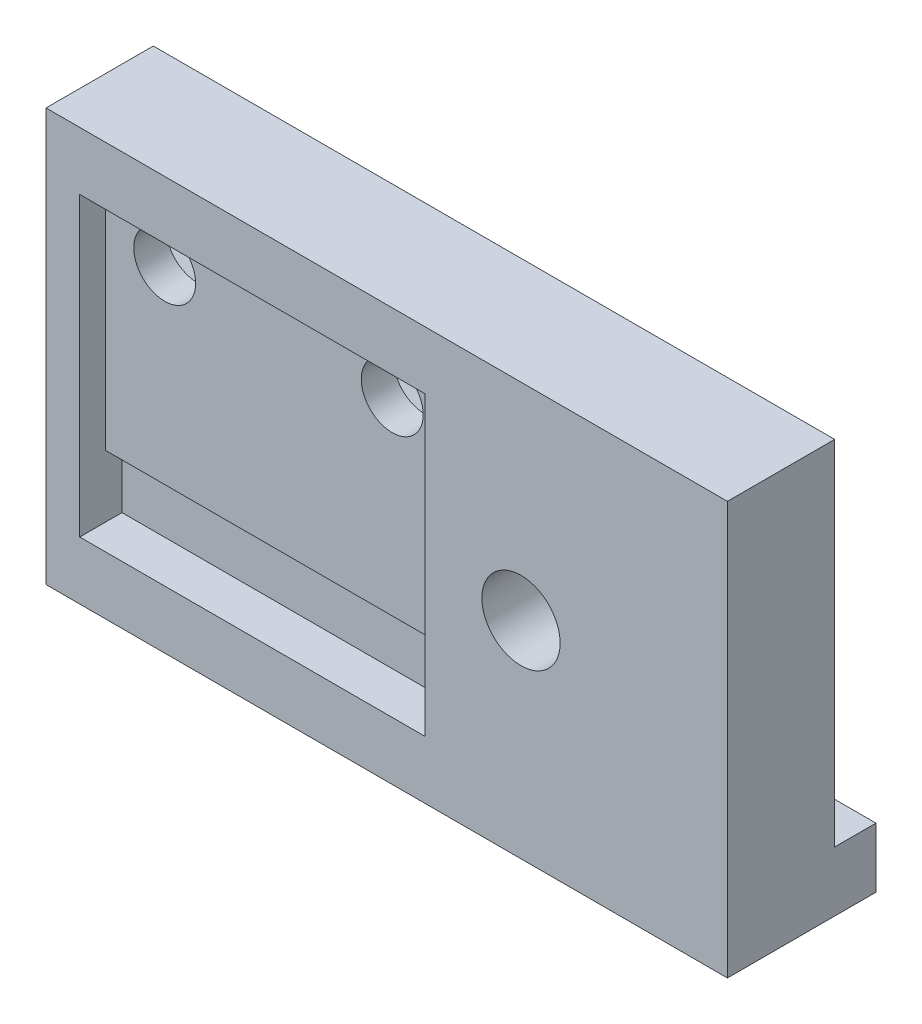
ISO-10303-21;
HEADER;
FILE_DESCRIPTION(('STEP AP214'),'2;1');
FILE_NAME('part.step','',(''),(''),'','','');
FILE_SCHEMA(('AUTOMOTIVE_DESIGN { 1 0 10303 214 1 1 1 1 }'));
ENDSEC;
DATA;
#1=APPLICATION_CONTEXT('core data for automotive mechanical design processes');
#2=APPLICATION_PROTOCOL_DEFINITION('international standard','automotive_design',2000,#1);
#3=PRODUCT_CONTEXT('',#1,'mechanical');
#4=PRODUCT('Part','Part','',(#3));
#5=PRODUCT_RELATED_PRODUCT_CATEGORY('part','',(#4));
#6=PRODUCT_DEFINITION_FORMATION('','',#4);
#7=PRODUCT_DEFINITION_CONTEXT('part definition',#1,'design');
#8=PRODUCT_DEFINITION('design','',#6,#7);
#9=PRODUCT_DEFINITION_SHAPE('','',#8);
#10=(LENGTH_UNIT() NAMED_UNIT(*) SI_UNIT(.MILLI.,.METRE.));
#11=(NAMED_UNIT(*) PLANE_ANGLE_UNIT() SI_UNIT($,.RADIAN.));
#12=(NAMED_UNIT(*) SI_UNIT($,.STERADIAN.) SOLID_ANGLE_UNIT());
#13=UNCERTAINTY_MEASURE_WITH_UNIT(LENGTH_MEASURE(1.E-05),#10,'distance_accuracy_value','');
#14=(GEOMETRIC_REPRESENTATION_CONTEXT(3) GLOBAL_UNCERTAINTY_ASSIGNED_CONTEXT((#13)) GLOBAL_UNIT_ASSIGNED_CONTEXT((#10,
#11,#12)) REPRESENTATION_CONTEXT('',''));
#15=CARTESIAN_POINT('',(0.,0.,0.));
#16=DIRECTION('',(0.,0.,1.));
#17=DIRECTION('',(1.,0.,0.));
#18=AXIS2_PLACEMENT_3D('',#15,#16,#17);
#19=CARTESIAN_POINT('',(0.,0.,0.));
#20=DIRECTION('',(0.,0.,-1.));
#21=DIRECTION('',(-1.,0.,0.));
#22=AXIS2_PLACEMENT_3D('',#19,#20,#21);
#23=PLANE('',#22);
#24=CARTESIAN_POINT('',(19.7,19.05,0.));
#25=DIRECTION('',(0.,0.,1.));
#26=DIRECTION('',(1.,0.,0.));
#27=AXIS2_PLACEMENT_3D('',#24,#25,#26);
#28=CIRCLE('',#27,1.9039967);
#29=CARTESIAN_POINT('',(21.6039967,19.05,0.));
#30=VERTEX_POINT('',#29);
#31=EDGE_CURVE('E459',#30,#30,#28,.T.);
#32=ORIENTED_EDGE('',*,*,#31,.T.);
#33=EDGE_LOOP('',(#32));
#34=FACE_BOUND('',#33,.T.);
#35=DIRECTION('',(-0.866025403784439,-0.5,0.));
#36=VECTOR('',#35,1.);
#37=CARTESIAN_POINT('',(22.8309945,17.2423194825938,0.));
#38=LINE('',#37,#36);
#39=CARTESIAN_POINT('',(22.8309945,17.2423194825938,0.));
#40=VERTEX_POINT('',#39);
#41=CARTESIAN_POINT('',(19.7,15.4346389651875,0.));
#42=VERTEX_POINT('',#41);
#43=EDGE_CURVE('E339',#40,#42,#38,.T.);
#44=ORIENTED_EDGE('',*,*,#43,.T.);
#45=DIRECTION('',(-0.866025403784438,0.5,0.));
#46=VECTOR('',#45,1.);
#47=CARTESIAN_POINT('',(19.7,15.4346389651875,0.));
#48=LINE('',#47,#46);
#49=CARTESIAN_POINT('',(16.5690055,17.2423194825938,0.));
#50=VERTEX_POINT('',#49);
#51=EDGE_CURVE('E334',#42,#50,#48,.T.);
#52=ORIENTED_EDGE('',*,*,#51,.T.);
#53=DIRECTION('',(0.,1.,0.));
#54=VECTOR('',#53,1.);
#55=CARTESIAN_POINT('',(16.5690055,17.2423194825938,0.));
#56=LINE('',#55,#54);
#57=CARTESIAN_POINT('',(16.5690055,20.8576805174062,0.));
#58=VERTEX_POINT('',#57);
#59=EDGE_CURVE('E358',#50,#58,#56,.T.);
#60=ORIENTED_EDGE('',*,*,#59,.T.);
#61=DIRECTION('',(0.866025403784438,0.5,0.));
#62=VECTOR('',#61,1.);
#63=CARTESIAN_POINT('',(16.5690055,20.8576805174062,0.));
#64=LINE('',#63,#62);
#65=CARTESIAN_POINT('',(19.7,22.6653610348125,0.));
#66=VERTEX_POINT('',#65);
#67=EDGE_CURVE('E362',#58,#66,#64,.T.);
#68=ORIENTED_EDGE('',*,*,#67,.T.);
#69=DIRECTION('',(0.866025403784439,-0.5,0.));
#70=VECTOR('',#69,1.);
#71=CARTESIAN_POINT('',(19.7,22.6653610348125,0.));
#72=LINE('',#71,#70);
#73=CARTESIAN_POINT('',(22.8309945,20.8576805174062,0.));
#74=VERTEX_POINT('',#73);
#75=EDGE_CURVE('E366',#66,#74,#72,.T.);
#76=ORIENTED_EDGE('',*,*,#75,.T.);
#77=DIRECTION('',(0.,-1.,0.));
#78=VECTOR('',#77,1.);
#79=CARTESIAN_POINT('',(22.8309945,20.8576805174062,0.));
#80=LINE('',#79,#78);
#81=EDGE_CURVE('E370',#74,#40,#80,.T.);
#82=ORIENTED_EDGE('',*,*,#81,.T.);
#83=EDGE_LOOP('',(#44,#52,#60,#68,#76,#82));
#84=FACE_BOUND('',#83,.T.);
#85=ADVANCED_FACE('F39',(#34,#84),#23,.T.);
#86=CARTESIAN_POINT('',(5.7,19.05,0.));
#87=DIRECTION('',(0.,0.,1.));
#88=DIRECTION('',(1.,0.,0.));
#89=AXIS2_PLACEMENT_3D('',#86,#87,#88);
#90=CIRCLE('',#89,1.9039967);
#91=CARTESIAN_POINT('',(7.6039967,19.05,0.));
#92=VERTEX_POINT('',#91);
#93=EDGE_CURVE('E464',#92,#92,#90,.T.);
#94=ORIENTED_EDGE('',*,*,#93,.T.);
#95=EDGE_LOOP('',(#94));
#96=FACE_BOUND('',#95,.T.);
#97=DIRECTION('',(-0.866025403784438,0.500000000000001,0.));
#98=VECTOR('',#97,1.);
#99=CARTESIAN_POINT('',(5.7,15.4346389651875,0.));
#100=LINE('',#99,#98);
#101=CARTESIAN_POINT('',(5.7,15.4346389651875,0.));
#102=VERTEX_POINT('',#101);
#103=CARTESIAN_POINT('',(2.5690055,17.2423194825938,0.));
#104=VERTEX_POINT('',#103);
#105=EDGE_CURVE('E277',#102,#104,#100,.T.);
#106=ORIENTED_EDGE('',*,*,#105,.T.);
#107=DIRECTION('',(0.,1.,0.));
#108=VECTOR('',#107,1.);
#109=CARTESIAN_POINT('',(2.5690055,17.2423194825938,0.));
#110=LINE('',#109,#108);
#111=CARTESIAN_POINT('',(2.5690055,20.8576805174062,0.));
#112=VERTEX_POINT('',#111);
#113=EDGE_CURVE('E272',#104,#112,#110,.T.);
#114=ORIENTED_EDGE('',*,*,#113,.T.);
#115=DIRECTION('',(0.866025403784439,0.5,0.));
#116=VECTOR('',#115,1.);
#117=CARTESIAN_POINT('',(2.5690055,20.8576805174062,0.));
#118=LINE('',#117,#116);
#119=CARTESIAN_POINT('',(5.69999999999999,22.6653610348125,0.));
#120=VERTEX_POINT('',#119);
#121=EDGE_CURVE('E297',#112,#120,#118,.T.);
#122=ORIENTED_EDGE('',*,*,#121,.T.);
#123=DIRECTION('',(0.866025403784439,-0.5,0.));
#124=VECTOR('',#123,1.);
#125=CARTESIAN_POINT('',(5.69999999999999,22.6653610348125,0.));
#126=LINE('',#125,#124);
#127=CARTESIAN_POINT('',(8.83099449999999,20.8576805174062,0.));
#128=VERTEX_POINT('',#127);
#129=EDGE_CURVE('E301',#120,#128,#126,.T.);
#130=ORIENTED_EDGE('',*,*,#129,.T.);
#131=DIRECTION('',(0.,-1.,0.));
#132=VECTOR('',#131,1.);
#133=CARTESIAN_POINT('',(8.83099449999999,20.8576805174062,0.));
#134=LINE('',#133,#132);
#135=CARTESIAN_POINT('',(8.83099449999999,17.2423194825938,0.));
#136=VERTEX_POINT('',#135);
#137=EDGE_CURVE('E305',#128,#136,#134,.T.);
#138=ORIENTED_EDGE('',*,*,#137,.T.);
#139=DIRECTION('',(-0.866025403784439,-0.5,0.));
#140=VECTOR('',#139,1.);
#141=CARTESIAN_POINT('',(8.83099449999999,17.2423194825938,0.));
#142=LINE('',#141,#140);
#143=EDGE_CURVE('E309',#136,#102,#142,.T.);
#144=ORIENTED_EDGE('',*,*,#143,.T.);
#145=EDGE_LOOP('',(#106,#114,#122,#130,#138,#144));
#146=FACE_BOUND('',#145,.T.);
#147=ADVANCED_FACE('F533',(#96,#146),#23,.T.);
#148=CARTESIAN_POINT('',(0.,0.,2.));
#149=DIRECTION('',(0.,0.,-1.));
#150=DIRECTION('',(-1.,0.,0.));
#151=AXIS2_PLACEMENT_3D('',#148,#149,#150);
#152=PLANE('',#151);
#153=DIRECTION('',(0.,-1.,0.));
#154=VECTOR('',#153,1.);
#155=CARTESIAN_POINT('',(2.073,3.573,2.));
#156=LINE('',#155,#154);
#157=CARTESIAN_POINT('',(2.073,21.827,2.));
#158=VERTEX_POINT('',#157);
#159=CARTESIAN_POINT('',(2.073,7.383,2.));
#160=VERTEX_POINT('',#159);
#161=EDGE_CURVE('E418',#158,#160,#156,.T.);
#162=ORIENTED_EDGE('',*,*,#161,.T.);
#163=DIRECTION('',(-1.,0.,0.));
#164=VECTOR('',#163,1.);
#165=CARTESIAN_POINT('',(2.073,7.383,2.));
#166=LINE('',#165,#164);
#167=CARTESIAN_POINT('',(23.327,7.383,2.));
#168=VERTEX_POINT('',#167);
#169=EDGE_CURVE('E231',#168,#160,#166,.T.);
#170=ORIENTED_EDGE('',*,*,#169,.F.);
#171=DIRECTION('',(0.,1.,0.));
#172=VECTOR('',#171,1.);
#173=CARTESIAN_POINT('',(23.327,3.573,2.));
#174=LINE('',#173,#172);
#175=CARTESIAN_POINT('',(23.327,21.827,2.));
#176=VERTEX_POINT('',#175);
#177=EDGE_CURVE('E413',#168,#176,#174,.T.);
#178=ORIENTED_EDGE('',*,*,#177,.T.);
#179=DIRECTION('',(-1.,0.,0.));
#180=VECTOR('',#179,1.);
#181=CARTESIAN_POINT('',(2.073,21.827,2.));
#182=LINE('',#181,#180);
#183=EDGE_CURVE('E428',#176,#158,#182,.T.);
#184=ORIENTED_EDGE('',*,*,#183,.T.);
#185=EDGE_LOOP('',(#162,#170,#178,#184));
#186=FACE_BOUND('',#185,.T.);
#187=CARTESIAN_POINT('',(5.7,19.05,2.));
#188=DIRECTION('',(0.,0.,1.));
#189=DIRECTION('',(1.,0.,0.));
#190=AXIS2_PLACEMENT_3D('',#187,#188,#189);
#191=CIRCLE('',#190,1.9039967);
#192=CARTESIAN_POINT('',(7.6039967,19.05,2.));
#193=VERTEX_POINT('',#192);
#194=EDGE_CURVE('E468',#193,#193,#191,.T.);
#195=ORIENTED_EDGE('',*,*,#194,.F.);
#196=EDGE_LOOP('',(#195));
#197=FACE_BOUND('',#196,.T.);
#198=CARTESIAN_POINT('',(19.7,19.05,2.));
#199=DIRECTION('',(0.,0.,1.));
#200=DIRECTION('',(1.,0.,0.));
#201=AXIS2_PLACEMENT_3D('',#198,#199,#200);
#202=CIRCLE('',#201,1.9039967);
#203=CARTESIAN_POINT('',(21.6039967,19.05,2.));
#204=VERTEX_POINT('',#203);
#205=EDGE_CURVE('E460',#204,#204,#202,.T.);
#206=ORIENTED_EDGE('',*,*,#205,.F.);
#207=EDGE_LOOP('',(#206));
#208=FACE_BOUND('',#207,.T.);
#209=ADVANCED_FACE('F562',(#186,#197,#208),#152,.F.);
#210=CARTESIAN_POINT('',(0.,0.,2.));
#211=DIRECTION('',(1.,0.,0.));
#212=DIRECTION('',(0.,0.,-1.));
#213=AXIS2_PLACEMENT_3D('',#210,#211,#212);
#214=PLANE('',#213);
#215=DIRECTION('',(0.,0.,-1.));
#216=VECTOR('',#215,1.);
#217=CARTESIAN_POINT('',(0.,25.4,2.));
#218=LINE('',#217,#216);
#219=CARTESIAN_POINT('',(0.,25.4,3.6));
#220=VERTEX_POINT('',#219);
#221=CARTESIAN_POINT('',(0.,25.4,-3.));
#222=VERTEX_POINT('',#221);
#223=EDGE_CURVE('E472',#220,#222,#218,.T.);
#224=ORIENTED_EDGE('',*,*,#223,.T.);
#225=DIRECTION('',(0.,1.,0.));
#226=VECTOR('',#225,1.);
#227=CARTESIAN_POINT('',(0.,0.,-3.));
#228=LINE('',#227,#226);
#229=CARTESIAN_POINT('',(0.,3.683,-3.));
#230=VERTEX_POINT('',#229);
#231=EDGE_CURVE('E399',#230,#222,#228,.T.);
#232=ORIENTED_EDGE('',*,*,#231,.F.);
#233=DIRECTION('',(0.,0.,1.));
#234=VECTOR('',#233,1.);
#235=CARTESIAN_POINT('',(0.,3.683,-5.54));
#236=LINE('',#235,#234);
#237=CARTESIAN_POINT('',(0.,3.683,-5.54));
#238=VERTEX_POINT('',#237);
#239=EDGE_CURVE('E268',#238,#230,#236,.T.);
#240=ORIENTED_EDGE('',*,*,#239,.F.);
#241=DIRECTION('',(0.,1.,0.));
#242=VECTOR('',#241,1.);
#243=CARTESIAN_POINT('',(0.,0.,-5.54));
#244=LINE('',#243,#242);
#245=CARTESIAN_POINT('',(0.,0.,-5.54));
#246=VERTEX_POINT('',#245);
#247=EDGE_CURVE('E247',#246,#238,#244,.T.);
#248=ORIENTED_EDGE('',*,*,#247,.F.);
#249=DIRECTION('',(0.,0.,-1.));
#250=VECTOR('',#249,1.);
#251=CARTESIAN_POINT('',(0.,0.,2.));
#252=LINE('',#251,#250);
#253=CARTESIAN_POINT('',(0.,0.,3.6));
#254=VERTEX_POINT('',#253);
#255=EDGE_CURVE('E11',#254,#246,#252,.T.);
#256=ORIENTED_EDGE('',*,*,#255,.F.);
#257=DIRECTION('',(0.,-1.,0.));
#258=VECTOR('',#257,1.);
#259=CARTESIAN_POINT('',(0.,25.4,3.6));
#260=LINE('',#259,#258);
#261=EDGE_CURVE('E447',#220,#254,#260,.T.);
#262=ORIENTED_EDGE('',*,*,#261,.F.);
#263=EDGE_LOOP('',(#224,#232,#240,#248,#256,#262));
#264=FACE_BOUND('',#263,.T.);
#265=ADVANCED_FACE('F41',(#264),#214,.F.);
#266=CARTESIAN_POINT('',(0.,0.,2.));
#267=DIRECTION('',(0.,1.,0.));
#268=DIRECTION('',(0.,0.,1.));
#269=AXIS2_PLACEMENT_3D('',#266,#267,#268);
#270=PLANE('',#269);
#271=ORIENTED_EDGE('',*,*,#255,.T.);
#272=DIRECTION('',(-1.,0.,0.));
#273=VECTOR('',#272,1.);
#274=CARTESIAN_POINT('',(41.925,0.,-5.54));
#275=LINE('',#274,#273);
#276=CARTESIAN_POINT('',(41.925,0.,-5.54));
#277=VERTEX_POINT('',#276);
#278=EDGE_CURVE('E258',#277,#246,#275,.T.);
#279=ORIENTED_EDGE('',*,*,#278,.F.);
#280=DIRECTION('',(0.,0.,-1.));
#281=VECTOR('',#280,1.);
#282=CARTESIAN_POINT('',(41.925,0.,2.));
#283=LINE('',#282,#281);
#284=CARTESIAN_POINT('',(41.925,0.,3.6));
#285=VERTEX_POINT('',#284);
#286=EDGE_CURVE('E48',#285,#277,#283,.T.);
#287=ORIENTED_EDGE('',*,*,#286,.F.);
#288=DIRECTION('',(1.,0.,0.));
#289=VECTOR('',#288,1.);
#290=CARTESIAN_POINT('',(0.,0.,3.6));
#291=LINE('',#290,#289);
#292=EDGE_CURVE('E451',#254,#285,#291,.T.);
#293=ORIENTED_EDGE('',*,*,#292,.F.);
#294=EDGE_LOOP('',(#271,#279,#287,#293));
#295=FACE_BOUND('',#294,.T.);
#296=ADVANCED_FACE('F493',(#295),#270,.F.);
#297=CARTESIAN_POINT('',(41.925,0.,2.));
#298=DIRECTION('',(-1.,0.,0.));
#299=DIRECTION('',(0.,0.,1.));
#300=AXIS2_PLACEMENT_3D('',#297,#298,#299);
#301=PLANE('',#300);
#302=ORIENTED_EDGE('',*,*,#286,.T.);
#303=DIRECTION('',(0.,-1.,0.));
#304=VECTOR('',#303,1.);
#305=CARTESIAN_POINT('',(41.925,3.68299999999999,-5.54));
#306=LINE('',#305,#304);
#307=CARTESIAN_POINT('',(41.925,3.68299999999999,-5.54));
#308=VERTEX_POINT('',#307);
#309=EDGE_CURVE('E254',#308,#277,#306,.T.);
#310=ORIENTED_EDGE('',*,*,#309,.F.);
#311=DIRECTION('',(0.,0.,1.));
#312=VECTOR('',#311,1.);
#313=CARTESIAN_POINT('',(41.925,3.68299999999999,-5.54));
#314=LINE('',#313,#312);
#315=CARTESIAN_POINT('',(41.925,3.68299999999999,-3.));
#316=VERTEX_POINT('',#315);
#317=EDGE_CURVE('E262',#308,#316,#314,.T.);
#318=ORIENTED_EDGE('',*,*,#317,.T.);
#319=DIRECTION('',(0.,-1.,0.));
#320=VECTOR('',#319,1.);
#321=CARTESIAN_POINT('',(41.925,25.4,-3.));
#322=LINE('',#321,#320);
#323=CARTESIAN_POINT('',(41.925,25.4,-3.));
#324=VERTEX_POINT('',#323);
#325=EDGE_CURVE('E406',#324,#316,#322,.T.);
#326=ORIENTED_EDGE('',*,*,#325,.F.);
#327=DIRECTION('',(0.,0.,-1.));
#328=VECTOR('',#327,1.);
#329=CARTESIAN_POINT('',(41.925,25.4,2.));
#330=LINE('',#329,#328);
#331=CARTESIAN_POINT('',(41.925,25.4,3.6));
#332=VERTEX_POINT('',#331);
#333=EDGE_CURVE('E479',#332,#324,#330,.T.);
#334=ORIENTED_EDGE('',*,*,#333,.F.);
#335=DIRECTION('',(0.,1.,0.));
#336=VECTOR('',#335,1.);
#337=CARTESIAN_POINT('',(41.925,0.,3.6));
#338=LINE('',#337,#336);
#339=EDGE_CURVE('E455',#285,#332,#338,.T.);
#340=ORIENTED_EDGE('',*,*,#339,.F.);
#341=EDGE_LOOP('',(#302,#310,#318,#326,#334,#340));
#342=FACE_BOUND('',#341,.T.);
#343=ADVANCED_FACE('F485',(#342),#301,.F.);
#344=CARTESIAN_POINT('',(0.,25.4,2.));
#345=DIRECTION('',(0.,-1.,0.));
#346=DIRECTION('',(0.,0.,-1.));
#347=AXIS2_PLACEMENT_3D('',#344,#345,#346);
#348=PLANE('',#347);
#349=ORIENTED_EDGE('',*,*,#333,.T.);
#350=DIRECTION('',(1.,0.,0.));
#351=VECTOR('',#350,1.);
#352=CARTESIAN_POINT('',(0.,25.4,-3.));
#353=LINE('',#352,#351);
#354=EDGE_CURVE('E402',#222,#324,#353,.T.);
#355=ORIENTED_EDGE('',*,*,#354,.F.);
#356=ORIENTED_EDGE('',*,*,#223,.F.);
#357=DIRECTION('',(-1.,0.,0.));
#358=VECTOR('',#357,1.);
#359=CARTESIAN_POINT('',(41.925,25.4,3.6));
#360=LINE('',#359,#358);
#361=EDGE_CURVE('E443',#332,#220,#360,.T.);
#362=ORIENTED_EDGE('',*,*,#361,.F.);
#363=EDGE_LOOP('',(#349,#355,#356,#362));
#364=FACE_BOUND('',#363,.T.);
#365=ADVANCED_FACE('F502',(#364),#348,.F.);
#366=CARTESIAN_POINT('',(5.7,19.05,2.));
#367=DIRECTION('',(0.,0.,-1.));
#368=DIRECTION('',(-1.,0.,0.));
#369=AXIS2_PLACEMENT_3D('',#366,#367,#368);
#370=CYLINDRICAL_SURFACE('',#369,1.9039967);
#371=ORIENTED_EDGE('',*,*,#194,.T.);
#372=EDGE_LOOP('',(#371));
#373=FACE_BOUND('',#372,.T.);
#374=ORIENTED_EDGE('',*,*,#93,.F.);
#375=EDGE_LOOP('',(#374));
#376=FACE_BOUND('',#375,.T.);
#377=ADVANCED_FACE('F570',(#373,#376),#370,.F.);
#378=CARTESIAN_POINT('',(19.7,19.05,2.));
#379=DIRECTION('',(0.,0.,-1.));
#380=DIRECTION('',(-1.,0.,0.));
#381=AXIS2_PLACEMENT_3D('',#378,#379,#380);
#382=CYLINDRICAL_SURFACE('',#381,1.9039967);
#383=ORIENTED_EDGE('',*,*,#205,.T.);
#384=EDGE_LOOP('',(#383));
#385=FACE_BOUND('',#384,.T.);
#386=ORIENTED_EDGE('',*,*,#31,.F.);
#387=EDGE_LOOP('',(#386));
#388=FACE_BOUND('',#387,.T.);
#389=ADVANCED_FACE('F588',(#385,#388),#382,.F.);
#390=CARTESIAN_POINT('',(29.225,12.7,2.));
#391=DIRECTION('',(0.,0.,-1.));
#392=DIRECTION('',(-1.,0.,0.));
#393=AXIS2_PLACEMENT_3D('',#390,#391,#392);
#394=CYLINDRICAL_SURFACE('',#393,2.40665);
#395=CARTESIAN_POINT('',(29.225,12.7,3.6));
#396=DIRECTION('',(0.,0.,1.));
#397=DIRECTION('',(1.,0.,0.));
#398=AXIS2_PLACEMENT_3D('',#395,#396,#397);
#399=CIRCLE('',#398,2.40665);
#400=CARTESIAN_POINT('',(31.63165,12.7,3.6));
#401=VERTEX_POINT('',#400);
#402=EDGE_CURVE('E409',#401,#401,#399,.T.);
#403=ORIENTED_EDGE('',*,*,#402,.T.);
#404=EDGE_LOOP('',(#403));
#405=FACE_BOUND('',#404,.T.);
#406=CARTESIAN_POINT('',(29.225,12.7,-3.));
#407=DIRECTION('',(0.,0.,-1.));
#408=DIRECTION('',(-1.,0.,0.));
#409=AXIS2_PLACEMENT_3D('',#406,#407,#408);
#410=CIRCLE('',#409,2.40665);
#411=CARTESIAN_POINT('',(26.81835,12.7,-3.));
#412=VERTEX_POINT('',#411);
#413=EDGE_CURVE('E395',#412,#412,#410,.T.);
#414=ORIENTED_EDGE('',*,*,#413,.T.);
#415=EDGE_LOOP('',(#414));
#416=FACE_BOUND('',#415,.T.);
#417=ADVANCED_FACE('F591',(#405,#416),#394,.F.);
#418=CARTESIAN_POINT('',(0.,0.,3.6));
#419=DIRECTION('',(0.,0.,1.));
#420=DIRECTION('',(1.,0.,0.));
#421=AXIS2_PLACEMENT_3D('',#418,#419,#420);
#422=PLANE('',#421);
#423=DIRECTION('',(-1.,0.,0.));
#424=VECTOR('',#423,1.);
#425=CARTESIAN_POINT('',(2.073,21.827,3.6));
#426=LINE('',#425,#424);
#427=CARTESIAN_POINT('',(23.327,21.827,3.6));
#428=VERTEX_POINT('',#427);
#429=CARTESIAN_POINT('',(2.073,21.827,3.6));
#430=VERTEX_POINT('',#429);
#431=EDGE_CURVE('E417',#428,#430,#426,.T.);
#432=ORIENTED_EDGE('',*,*,#431,.F.);
#433=DIRECTION('',(0.,1.,0.));
#434=VECTOR('',#433,1.);
#435=CARTESIAN_POINT('',(23.327,3.573,3.6));
#436=LINE('',#435,#434);
#437=CARTESIAN_POINT('',(23.327,3.573,3.6));
#438=VERTEX_POINT('',#437);
#439=EDGE_CURVE('E414',#438,#428,#436,.T.);
#440=ORIENTED_EDGE('',*,*,#439,.F.);
#441=DIRECTION('',(1.,0.,0.));
#442=VECTOR('',#441,1.);
#443=CARTESIAN_POINT('',(2.073,3.573,3.6));
#444=LINE('',#443,#442);
#445=CARTESIAN_POINT('',(2.073,3.573,3.6));
#446=VERTEX_POINT('',#445);
#447=EDGE_CURVE('E423',#446,#438,#444,.T.);
#448=ORIENTED_EDGE('',*,*,#447,.F.);
#449=DIRECTION('',(0.,-1.,0.));
#450=VECTOR('',#449,1.);
#451=CARTESIAN_POINT('',(2.073,3.573,3.6));
#452=LINE('',#451,#450);
#453=EDGE_CURVE('E210',#430,#446,#452,.T.);
#454=ORIENTED_EDGE('',*,*,#453,.F.);
#455=EDGE_LOOP('',(#432,#440,#448,#454));
#456=FACE_BOUND('',#455,.T.);
#457=ORIENTED_EDGE('',*,*,#361,.T.);
#458=ORIENTED_EDGE('',*,*,#261,.T.);
#459=ORIENTED_EDGE('',*,*,#292,.T.);
#460=ORIENTED_EDGE('',*,*,#339,.T.);
#461=EDGE_LOOP('',(#457,#458,#459,#460));
#462=FACE_BOUND('',#461,.T.);
#463=ORIENTED_EDGE('',*,*,#402,.F.);
#464=EDGE_LOOP('',(#463));
#465=FACE_BOUND('',#464,.T.);
#466=ADVANCED_FACE('F498',(#456,#462,#465),#422,.T.);
#467=CARTESIAN_POINT('',(23.327,3.573,3.6));
#468=DIRECTION('',(-1.,0.,0.));
#469=DIRECTION('',(0.,0.,1.));
#470=AXIS2_PLACEMENT_3D('',#467,#468,#469);
#471=PLANE('',#470);
#472=ORIENTED_EDGE('',*,*,#177,.F.);
#473=DIRECTION('',(0.,0.,1.));
#474=VECTOR('',#473,1.);
#475=CARTESIAN_POINT('',(23.327,7.383,1.));
#476=LINE('',#475,#474);
#477=CARTESIAN_POINT('',(23.327,7.383,1.));
#478=VERTEX_POINT('',#477);
#479=EDGE_CURVE('E240',#478,#168,#476,.T.);
#480=ORIENTED_EDGE('',*,*,#479,.F.);
#481=DIRECTION('',(0.,1.,0.));
#482=VECTOR('',#481,1.);
#483=CARTESIAN_POINT('',(23.327,7.383,1.));
#484=LINE('',#483,#482);
#485=CARTESIAN_POINT('',(23.327,3.573,1.));
#486=VERTEX_POINT('',#485);
#487=EDGE_CURVE('E225',#486,#478,#484,.T.);
#488=ORIENTED_EDGE('',*,*,#487,.F.);
#489=DIRECTION('',(0.,0.,-1.));
#490=VECTOR('',#489,1.);
#491=CARTESIAN_POINT('',(23.327,3.573,3.6));
#492=LINE('',#491,#490);
#493=EDGE_CURVE('E215',#438,#486,#492,.T.);
#494=ORIENTED_EDGE('',*,*,#493,.F.);
#495=ORIENTED_EDGE('',*,*,#439,.T.);
#496=DIRECTION('',(0.,0.,-1.));
#497=VECTOR('',#496,1.);
#498=CARTESIAN_POINT('',(23.327,21.827,3.6));
#499=LINE('',#498,#497);
#500=EDGE_CURVE('E439',#428,#176,#499,.T.);
#501=ORIENTED_EDGE('',*,*,#500,.T.);
#502=EDGE_LOOP('',(#472,#480,#488,#494,#495,#501));
#503=FACE_BOUND('',#502,.T.);
#504=ADVANCED_FACE('F604',(#503),#471,.T.);
#505=CARTESIAN_POINT('',(2.073,21.827,3.6));
#506=DIRECTION('',(0.,-1.,0.));
#507=DIRECTION('',(0.,0.,-1.));
#508=AXIS2_PLACEMENT_3D('',#505,#506,#507);
#509=PLANE('',#508);
#510=ORIENTED_EDGE('',*,*,#183,.F.);
#511=ORIENTED_EDGE('',*,*,#500,.F.);
#512=ORIENTED_EDGE('',*,*,#431,.T.);
#513=DIRECTION('',(0.,0.,-1.));
#514=VECTOR('',#513,1.);
#515=CARTESIAN_POINT('',(2.073,21.827,3.6));
#516=LINE('',#515,#514);
#517=EDGE_CURVE('E214',#430,#158,#516,.T.);
#518=ORIENTED_EDGE('',*,*,#517,.T.);
#519=EDGE_LOOP('',(#510,#511,#512,#518));
#520=FACE_BOUND('',#519,.T.);
#521=ADVANCED_FACE('F608',(#520),#509,.T.);
#522=CARTESIAN_POINT('',(2.073,3.573,3.6));
#523=DIRECTION('',(1.,0.,0.));
#524=DIRECTION('',(0.,0.,-1.));
#525=AXIS2_PLACEMENT_3D('',#522,#523,#524);
#526=PLANE('',#525);
#527=ORIENTED_EDGE('',*,*,#161,.F.);
#528=ORIENTED_EDGE('',*,*,#517,.F.);
#529=ORIENTED_EDGE('',*,*,#453,.T.);
#530=DIRECTION('',(0.,0.,-1.));
#531=VECTOR('',#530,1.);
#532=CARTESIAN_POINT('',(2.073,3.573,3.6));
#533=LINE('',#532,#531);
#534=CARTESIAN_POINT('',(2.073,3.573,1.));
#535=VERTEX_POINT('',#534);
#536=EDGE_CURVE('E201',#446,#535,#533,.T.);
#537=ORIENTED_EDGE('',*,*,#536,.T.);
#538=DIRECTION('',(0.,-1.,0.));
#539=VECTOR('',#538,1.);
#540=CARTESIAN_POINT('',(2.073,7.383,1.));
#541=LINE('',#540,#539);
#542=CARTESIAN_POINT('',(2.073,7.383,1.));
#543=VERTEX_POINT('',#542);
#544=EDGE_CURVE('E206',#543,#535,#541,.T.);
#545=ORIENTED_EDGE('',*,*,#544,.F.);
#546=DIRECTION('',(0.,0.,1.));
#547=VECTOR('',#546,1.);
#548=CARTESIAN_POINT('',(2.073,7.383,1.));
#549=LINE('',#548,#547);
#550=EDGE_CURVE('E242',#543,#160,#549,.T.);
#551=ORIENTED_EDGE('',*,*,#550,.T.);
#552=EDGE_LOOP('',(#527,#528,#529,#537,#545,#551));
#553=FACE_BOUND('',#552,.T.);
#554=ADVANCED_FACE('F204',(#553),#526,.T.);
#555=CARTESIAN_POINT('',(2.073,3.573,3.6));
#556=DIRECTION('',(0.,1.,0.));
#557=DIRECTION('',(0.,0.,1.));
#558=AXIS2_PLACEMENT_3D('',#555,#556,#557);
#559=PLANE('',#558);
#560=ORIENTED_EDGE('',*,*,#493,.T.);
#561=DIRECTION('',(1.,0.,0.));
#562=VECTOR('',#561,1.);
#563=CARTESIAN_POINT('',(2.073,3.573,1.));
#564=LINE('',#563,#562);
#565=EDGE_CURVE('E218',#535,#486,#564,.T.);
#566=ORIENTED_EDGE('',*,*,#565,.F.);
#567=ORIENTED_EDGE('',*,*,#536,.F.);
#568=ORIENTED_EDGE('',*,*,#447,.T.);
#569=EDGE_LOOP('',(#560,#566,#567,#568));
#570=FACE_BOUND('',#569,.T.);
#571=ADVANCED_FACE('F219',(#570),#559,.T.);
#572=CARTESIAN_POINT('',(0.,0.,-3.));
#573=DIRECTION('',(0.,0.,-1.));
#574=DIRECTION('',(-1.,0.,0.));
#575=AXIS2_PLACEMENT_3D('',#572,#573,#574);
#576=PLANE('',#575);
#577=DIRECTION('',(1.,0.,0.));
#578=VECTOR('',#577,1.);
#579=CARTESIAN_POINT('',(0.,3.683,-3.));
#580=LINE('',#579,#578);
#581=EDGE_CURVE('E55',#230,#316,#580,.T.);
#582=ORIENTED_EDGE('',*,*,#581,.F.);
#583=ORIENTED_EDGE('',*,*,#231,.T.);
#584=ORIENTED_EDGE('',*,*,#354,.T.);
#585=ORIENTED_EDGE('',*,*,#325,.T.);
#586=EDGE_LOOP('',(#582,#583,#584,#585));
#587=FACE_BOUND('',#586,.T.);
#588=ORIENTED_EDGE('',*,*,#413,.F.);
#589=EDGE_LOOP('',(#588));
#590=FACE_BOUND('',#589,.T.);
#591=DIRECTION('',(0.,1.,0.));
#592=VECTOR('',#591,1.);
#593=CARTESIAN_POINT('',(16.5690055,17.2423194825938,-3.));
#594=LINE('',#593,#592);
#595=CARTESIAN_POINT('',(16.5690055,17.2423194825938,-3.));
#596=VERTEX_POINT('',#595);
#597=CARTESIAN_POINT('',(16.5690055,20.8576805174062,-3.));
#598=VERTEX_POINT('',#597);
#599=EDGE_CURVE('E338',#596,#598,#594,.T.);
#600=ORIENTED_EDGE('',*,*,#599,.F.);
#601=DIRECTION('',(-0.866025403784438,0.5,0.));
#602=VECTOR('',#601,1.);
#603=CARTESIAN_POINT('',(19.7,15.4346389651875,-3.));
#604=LINE('',#603,#602);
#605=CARTESIAN_POINT('',(19.7,15.4346389651875,-3.));
#606=VERTEX_POINT('',#605);
#607=EDGE_CURVE('E335',#606,#596,#604,.T.);
#608=ORIENTED_EDGE('',*,*,#607,.F.);
#609=DIRECTION('',(-0.866025403784439,-0.5,0.));
#610=VECTOR('',#609,1.);
#611=CARTESIAN_POINT('',(22.8309945,17.2423194825938,-3.));
#612=LINE('',#611,#610);
#613=CARTESIAN_POINT('',(22.8309945,17.2423194825938,-3.));
#614=VERTEX_POINT('',#613);
#615=EDGE_CURVE('E352',#614,#606,#612,.T.);
#616=ORIENTED_EDGE('',*,*,#615,.F.);
#617=DIRECTION('',(0.,-1.,0.));
#618=VECTOR('',#617,1.);
#619=CARTESIAN_POINT('',(22.8309945,20.8576805174062,-3.));
#620=LINE('',#619,#618);
#621=CARTESIAN_POINT('',(22.8309945,20.8576805174062,-3.));
#622=VERTEX_POINT('',#621);
#623=EDGE_CURVE('E348',#622,#614,#620,.T.);
#624=ORIENTED_EDGE('',*,*,#623,.F.);
#625=DIRECTION('',(0.866025403784439,-0.5,0.));
#626=VECTOR('',#625,1.);
#627=CARTESIAN_POINT('',(19.7,22.6653610348125,-3.));
#628=LINE('',#627,#626);
#629=CARTESIAN_POINT('',(19.7,22.6653610348125,-3.));
#630=VERTEX_POINT('',#629);
#631=EDGE_CURVE('E345',#630,#622,#628,.T.);
#632=ORIENTED_EDGE('',*,*,#631,.F.);
#633=DIRECTION('',(0.866025403784438,0.5,0.));
#634=VECTOR('',#633,1.);
#635=CARTESIAN_POINT('',(16.5690055,20.8576805174062,-3.));
#636=LINE('',#635,#634);
#637=EDGE_CURVE('E342',#598,#630,#636,.T.);
#638=ORIENTED_EDGE('',*,*,#637,.F.);
#639=EDGE_LOOP('',(#600,#608,#616,#624,#632,#638));
#640=FACE_BOUND('',#639,.T.);
#641=DIRECTION('',(0.866025403784439,0.5,0.));
#642=VECTOR('',#641,1.);
#643=CARTESIAN_POINT('',(2.5690055,20.8576805174062,-3.));
#644=LINE('',#643,#642);
#645=CARTESIAN_POINT('',(2.5690055,20.8576805174062,-3.));
#646=VERTEX_POINT('',#645);
#647=CARTESIAN_POINT('',(5.69999999999999,22.6653610348125,-3.));
#648=VERTEX_POINT('',#647);
#649=EDGE_CURVE('E276',#646,#648,#644,.T.);
#650=ORIENTED_EDGE('',*,*,#649,.F.);
#651=DIRECTION('',(0.,1.,0.));
#652=VECTOR('',#651,1.);
#653=CARTESIAN_POINT('',(2.5690055,17.2423194825938,-3.));
#654=LINE('',#653,#652);
#655=CARTESIAN_POINT('',(2.5690055,17.2423194825938,-3.));
#656=VERTEX_POINT('',#655);
#657=EDGE_CURVE('E273',#656,#646,#654,.T.);
#658=ORIENTED_EDGE('',*,*,#657,.F.);
#659=DIRECTION('',(-0.866025403784438,0.500000000000001,0.));
#660=VECTOR('',#659,1.);
#661=CARTESIAN_POINT('',(5.7,15.4346389651875,-3.));
#662=LINE('',#661,#660);
#663=CARTESIAN_POINT('',(5.7,15.4346389651875,-3.));
#664=VERTEX_POINT('',#663);
#665=EDGE_CURVE('E290',#664,#656,#662,.T.);
#666=ORIENTED_EDGE('',*,*,#665,.F.);
#667=DIRECTION('',(-0.866025403784439,-0.5,0.));
#668=VECTOR('',#667,1.);
#669=CARTESIAN_POINT('',(8.83099449999999,17.2423194825938,-3.));
#670=LINE('',#669,#668);
#671=CARTESIAN_POINT('',(8.83099449999999,17.2423194825938,-3.));
#672=VERTEX_POINT('',#671);
#673=EDGE_CURVE('E286',#672,#664,#670,.T.);
#674=ORIENTED_EDGE('',*,*,#673,.F.);
#675=DIRECTION('',(0.,-1.,0.));
#676=VECTOR('',#675,1.);
#677=CARTESIAN_POINT('',(8.83099449999999,20.8576805174062,-3.));
#678=LINE('',#677,#676);
#679=CARTESIAN_POINT('',(8.83099449999999,20.8576805174062,-3.));
#680=VERTEX_POINT('',#679);
#681=EDGE_CURVE('E283',#680,#672,#678,.T.);
#682=ORIENTED_EDGE('',*,*,#681,.F.);
#683=DIRECTION('',(0.866025403784439,-0.5,0.));
#684=VECTOR('',#683,1.);
#685=CARTESIAN_POINT('',(5.69999999999999,22.6653610348125,-3.));
#686=LINE('',#685,#684);
#687=EDGE_CURVE('E280',#648,#680,#686,.T.);
#688=ORIENTED_EDGE('',*,*,#687,.F.);
#689=EDGE_LOOP('',(#650,#658,#666,#674,#682,#688));
#690=FACE_BOUND('',#689,.T.);
#691=ADVANCED_FACE('F507',(#587,#590,#640,#690),#576,.T.);
#692=CARTESIAN_POINT('',(19.7,15.4346389651875,-3.));
#693=DIRECTION('',(0.5,0.866025403784438,0.));
#694=DIRECTION('',(-0.866025403784438,0.5,0.));
#695=AXIS2_PLACEMENT_3D('',#692,#693,#694);
#696=PLANE('',#695);
#697=ORIENTED_EDGE('',*,*,#51,.F.);
#698=DIRECTION('',(0.,0.,1.));
#699=VECTOR('',#698,1.);
#700=CARTESIAN_POINT('',(19.7,15.4346389651875,-3.));
#701=LINE('',#700,#699);
#702=EDGE_CURVE('E63',#606,#42,#701,.T.);
#703=ORIENTED_EDGE('',*,*,#702,.F.);
#704=ORIENTED_EDGE('',*,*,#607,.T.);
#705=DIRECTION('',(0.,0.,1.));
#706=VECTOR('',#705,1.);
#707=CARTESIAN_POINT('',(16.5690055,17.2423194825938,-3.));
#708=LINE('',#707,#706);
#709=EDGE_CURVE('E391',#596,#50,#708,.T.);
#710=ORIENTED_EDGE('',*,*,#709,.T.);
#711=EDGE_LOOP('',(#697,#703,#704,#710));
#712=FACE_BOUND('',#711,.T.);
#713=ADVANCED_FACE('F510',(#712),#696,.T.);
#714=CARTESIAN_POINT('',(16.5690055,17.2423194825938,-3.));
#715=DIRECTION('',(1.,0.,0.));
#716=DIRECTION('',(0.,0.,-1.));
#717=AXIS2_PLACEMENT_3D('',#714,#715,#716);
#718=PLANE('',#717);
#719=ORIENTED_EDGE('',*,*,#59,.F.);
#720=ORIENTED_EDGE('',*,*,#709,.F.);
#721=ORIENTED_EDGE('',*,*,#599,.T.);
#722=DIRECTION('',(0.,0.,1.));
#723=VECTOR('',#722,1.);
#724=CARTESIAN_POINT('',(16.5690055,20.8576805174062,-3.));
#725=LINE('',#724,#723);
#726=EDGE_CURVE('E388',#598,#58,#725,.T.);
#727=ORIENTED_EDGE('',*,*,#726,.T.);
#728=EDGE_LOOP('',(#719,#720,#721,#727));
#729=FACE_BOUND('',#728,.T.);
#730=ADVANCED_FACE('F619',(#729),#718,.T.);
#731=CARTESIAN_POINT('',(16.5690055,20.8576805174062,-3.));
#732=DIRECTION('',(0.5,-0.866025403784438,0.));
#733=DIRECTION('',(0.866025403784438,0.5,0.));
#734=AXIS2_PLACEMENT_3D('',#731,#732,#733);
#735=PLANE('',#734);
#736=ORIENTED_EDGE('',*,*,#67,.F.);
#737=ORIENTED_EDGE('',*,*,#726,.F.);
#738=ORIENTED_EDGE('',*,*,#637,.T.);
#739=DIRECTION('',(0.,0.,1.));
#740=VECTOR('',#739,1.);
#741=CARTESIAN_POINT('',(19.7,22.6653610348125,-3.));
#742=LINE('',#741,#740);
#743=EDGE_CURVE('E385',#630,#66,#742,.T.);
#744=ORIENTED_EDGE('',*,*,#743,.T.);
#745=EDGE_LOOP('',(#736,#737,#738,#744));
#746=FACE_BOUND('',#745,.T.);
#747=ADVANCED_FACE('F623',(#746),#735,.T.);
#748=CARTESIAN_POINT('',(19.7,22.6653610348125,-3.));
#749=DIRECTION('',(-0.5,-0.866025403784439,0.));
#750=DIRECTION('',(0.866025403784439,-0.5,0.));
#751=AXIS2_PLACEMENT_3D('',#748,#749,#750);
#752=PLANE('',#751);
#753=ORIENTED_EDGE('',*,*,#75,.F.);
#754=ORIENTED_EDGE('',*,*,#743,.F.);
#755=ORIENTED_EDGE('',*,*,#631,.T.);
#756=DIRECTION('',(0.,0.,1.));
#757=VECTOR('',#756,1.);
#758=CARTESIAN_POINT('',(22.8309945,20.8576805174062,-3.));
#759=LINE('',#758,#757);
#760=EDGE_CURVE('E382',#622,#74,#759,.T.);
#761=ORIENTED_EDGE('',*,*,#760,.T.);
#762=EDGE_LOOP('',(#753,#754,#755,#761));
#763=FACE_BOUND('',#762,.T.);
#764=ADVANCED_FACE('F627',(#763),#752,.T.);
#765=CARTESIAN_POINT('',(22.8309945,20.8576805174062,-3.));
#766=DIRECTION('',(-1.,0.,0.));
#767=DIRECTION('',(0.,0.,1.));
#768=AXIS2_PLACEMENT_3D('',#765,#766,#767);
#769=PLANE('',#768);
#770=ORIENTED_EDGE('',*,*,#81,.F.);
#771=ORIENTED_EDGE('',*,*,#760,.F.);
#772=ORIENTED_EDGE('',*,*,#623,.T.);
#773=DIRECTION('',(0.,0.,1.));
#774=VECTOR('',#773,1.);
#775=CARTESIAN_POINT('',(22.8309945,17.2423194825938,-3.));
#776=LINE('',#775,#774);
#777=EDGE_CURVE('E379',#614,#40,#776,.T.);
#778=ORIENTED_EDGE('',*,*,#777,.T.);
#779=EDGE_LOOP('',(#770,#771,#772,#778));
#780=FACE_BOUND('',#779,.T.);
#781=ADVANCED_FACE('F631',(#780),#769,.T.);
#782=CARTESIAN_POINT('',(22.8309945,17.2423194825938,-3.));
#783=DIRECTION('',(-0.5,0.866025403784439,0.));
#784=DIRECTION('',(-0.866025403784439,-0.5,0.));
#785=AXIS2_PLACEMENT_3D('',#782,#783,#784);
#786=PLANE('',#785);
#787=ORIENTED_EDGE('',*,*,#43,.F.);
#788=ORIENTED_EDGE('',*,*,#777,.F.);
#789=ORIENTED_EDGE('',*,*,#615,.T.);
#790=ORIENTED_EDGE('',*,*,#702,.T.);
#791=EDGE_LOOP('',(#787,#788,#789,#790));
#792=FACE_BOUND('',#791,.T.);
#793=ADVANCED_FACE('F635',(#792),#786,.T.);
#794=CARTESIAN_POINT('',(2.5690055,17.2423194825938,-3.));
#795=DIRECTION('',(1.,0.,0.));
#796=DIRECTION('',(0.,0.,-1.));
#797=AXIS2_PLACEMENT_3D('',#794,#795,#796);
#798=PLANE('',#797);
#799=ORIENTED_EDGE('',*,*,#113,.F.);
#800=DIRECTION('',(0.,0.,1.));
#801=VECTOR('',#800,1.);
#802=CARTESIAN_POINT('',(2.5690055,17.2423194825938,-3.));
#803=LINE('',#802,#801);
#804=EDGE_CURVE('E293',#656,#104,#803,.T.);
#805=ORIENTED_EDGE('',*,*,#804,.F.);
#806=ORIENTED_EDGE('',*,*,#657,.T.);
#807=DIRECTION('',(0.,0.,1.));
#808=VECTOR('',#807,1.);
#809=CARTESIAN_POINT('',(2.5690055,20.8576805174062,-3.));
#810=LINE('',#809,#808);
#811=EDGE_CURVE('E330',#646,#112,#810,.T.);
#812=ORIENTED_EDGE('',*,*,#811,.T.);
#813=EDGE_LOOP('',(#799,#805,#806,#812));
#814=FACE_BOUND('',#813,.T.);
#815=ADVANCED_FACE('F536',(#814),#798,.T.);
#816=CARTESIAN_POINT('',(2.5690055,20.8576805174062,-3.));
#817=DIRECTION('',(0.5,-0.866025403784439,0.));
#818=DIRECTION('',(0.866025403784439,0.5,0.));
#819=AXIS2_PLACEMENT_3D('',#816,#817,#818);
#820=PLANE('',#819);
#821=ORIENTED_EDGE('',*,*,#121,.F.);
#822=ORIENTED_EDGE('',*,*,#811,.F.);
#823=ORIENTED_EDGE('',*,*,#649,.T.);
#824=DIRECTION('',(0.,0.,1.));
#825=VECTOR('',#824,1.);
#826=CARTESIAN_POINT('',(5.69999999999999,22.6653610348125,-3.));
#827=LINE('',#826,#825);
#828=EDGE_CURVE('E327',#648,#120,#827,.T.);
#829=ORIENTED_EDGE('',*,*,#828,.T.);
#830=EDGE_LOOP('',(#821,#822,#823,#829));
#831=FACE_BOUND('',#830,.T.);
#832=ADVANCED_FACE('F526',(#831),#820,.T.);
#833=CARTESIAN_POINT('',(5.69999999999999,22.6653610348125,-3.));
#834=DIRECTION('',(-0.5,-0.866025403784439,0.));
#835=DIRECTION('',(0.866025403784439,-0.5,0.));
#836=AXIS2_PLACEMENT_3D('',#833,#834,#835);
#837=PLANE('',#836);
#838=ORIENTED_EDGE('',*,*,#129,.F.);
#839=ORIENTED_EDGE('',*,*,#828,.F.);
#840=ORIENTED_EDGE('',*,*,#687,.T.);
#841=DIRECTION('',(0.,0.,1.));
#842=VECTOR('',#841,1.);
#843=CARTESIAN_POINT('',(8.83099449999999,20.8576805174062,-3.));
#844=LINE('',#843,#842);
#845=EDGE_CURVE('E324',#680,#128,#844,.T.);
#846=ORIENTED_EDGE('',*,*,#845,.T.);
#847=EDGE_LOOP('',(#838,#839,#840,#846));
#848=FACE_BOUND('',#847,.T.);
#849=ADVANCED_FACE('F529',(#848),#837,.T.);
#850=CARTESIAN_POINT('',(8.83099449999999,20.8576805174062,-3.));
#851=DIRECTION('',(-1.,0.,0.));
#852=DIRECTION('',(0.,0.,1.));
#853=AXIS2_PLACEMENT_3D('',#850,#851,#852);
#854=PLANE('',#853);
#855=ORIENTED_EDGE('',*,*,#137,.F.);
#856=ORIENTED_EDGE('',*,*,#845,.F.);
#857=ORIENTED_EDGE('',*,*,#681,.T.);
#858=DIRECTION('',(0.,0.,1.));
#859=VECTOR('',#858,1.);
#860=CARTESIAN_POINT('',(8.83099449999999,17.2423194825938,-3.));
#861=LINE('',#860,#859);
#862=EDGE_CURVE('E321',#672,#136,#861,.T.);
#863=ORIENTED_EDGE('',*,*,#862,.T.);
#864=EDGE_LOOP('',(#855,#856,#857,#863));
#865=FACE_BOUND('',#864,.T.);
#866=ADVANCED_FACE('F547',(#865),#854,.T.);
#867=CARTESIAN_POINT('',(8.83099449999999,17.2423194825938,-3.));
#868=DIRECTION('',(-0.5,0.866025403784438,0.));
#869=DIRECTION('',(-0.866025403784439,-0.5,0.));
#870=AXIS2_PLACEMENT_3D('',#867,#868,#869);
#871=PLANE('',#870);
#872=ORIENTED_EDGE('',*,*,#143,.F.);
#873=ORIENTED_EDGE('',*,*,#862,.F.);
#874=ORIENTED_EDGE('',*,*,#673,.T.);
#875=DIRECTION('',(0.,0.,1.));
#876=VECTOR('',#875,1.);
#877=CARTESIAN_POINT('',(5.7,15.4346389651875,-3.));
#878=LINE('',#877,#876);
#879=EDGE_CURVE('E318',#664,#102,#878,.T.);
#880=ORIENTED_EDGE('',*,*,#879,.T.);
#881=EDGE_LOOP('',(#872,#873,#874,#880));
#882=FACE_BOUND('',#881,.T.);
#883=ADVANCED_FACE('F545',(#882),#871,.T.);
#884=CARTESIAN_POINT('',(5.7,15.4346389651875,-3.));
#885=DIRECTION('',(0.5,0.866025403784438,0.));
#886=DIRECTION('',(-0.866025403784438,0.500000000000001,0.));
#887=AXIS2_PLACEMENT_3D('',#884,#885,#886);
#888=PLANE('',#887);
#889=ORIENTED_EDGE('',*,*,#105,.F.);
#890=ORIENTED_EDGE('',*,*,#879,.F.);
#891=ORIENTED_EDGE('',*,*,#665,.T.);
#892=ORIENTED_EDGE('',*,*,#804,.T.);
#893=EDGE_LOOP('',(#889,#890,#891,#892));
#894=FACE_BOUND('',#893,.T.);
#895=ADVANCED_FACE('F540',(#894),#888,.T.);
#896=CARTESIAN_POINT('',(0.,3.683,-5.54));
#897=DIRECTION('',(0.,-1.,0.));
#898=DIRECTION('',(1.,0.,0.));
#899=AXIS2_PLACEMENT_3D('',#896,#897,#898);
#900=PLANE('',#899);
#901=ORIENTED_EDGE('',*,*,#581,.T.);
#902=ORIENTED_EDGE('',*,*,#317,.F.);
#903=DIRECTION('',(1.,0.,0.));
#904=VECTOR('',#903,1.);
#905=CARTESIAN_POINT('',(0.,3.683,-5.54));
#906=LINE('',#905,#904);
#907=EDGE_CURVE('E251',#238,#308,#906,.T.);
#908=ORIENTED_EDGE('',*,*,#907,.F.);
#909=ORIENTED_EDGE('',*,*,#239,.T.);
#910=EDGE_LOOP('',(#901,#902,#908,#909));
#911=FACE_BOUND('',#910,.T.);
#912=ADVANCED_FACE('F505',(#911),#900,.F.);
#913=CARTESIAN_POINT('',(0.,0.,-5.54));
#914=DIRECTION('',(0.,0.,-1.));
#915=DIRECTION('',(-1.,0.,0.));
#916=AXIS2_PLACEMENT_3D('',#913,#914,#915);
#917=PLANE('',#916);
#918=ORIENTED_EDGE('',*,*,#247,.T.);
#919=ORIENTED_EDGE('',*,*,#907,.T.);
#920=ORIENTED_EDGE('',*,*,#309,.T.);
#921=ORIENTED_EDGE('',*,*,#278,.T.);
#922=EDGE_LOOP('',(#918,#919,#920,#921));
#923=FACE_BOUND('',#922,.T.);
#924=ADVANCED_FACE('F490',(#923),#917,.T.);
#925=CARTESIAN_POINT('',(2.073,7.383,1.));
#926=DIRECTION('',(0.,1.,0.));
#927=DIRECTION('',(0.,0.,1.));
#928=AXIS2_PLACEMENT_3D('',#925,#926,#927);
#929=PLANE('',#928);
#930=ORIENTED_EDGE('',*,*,#169,.T.);
#931=ORIENTED_EDGE('',*,*,#550,.F.);
#932=DIRECTION('',(-1.,0.,0.));
#933=VECTOR('',#932,1.);
#934=CARTESIAN_POINT('',(2.073,7.383,1.));
#935=LINE('',#934,#933);
#936=EDGE_CURVE('E229',#478,#543,#935,.T.);
#937=ORIENTED_EDGE('',*,*,#936,.F.);
#938=ORIENTED_EDGE('',*,*,#479,.T.);
#939=EDGE_LOOP('',(#930,#931,#937,#938));
#940=FACE_BOUND('',#939,.T.);
#941=ADVANCED_FACE('F709',(#940),#929,.F.);
#942=CARTESIAN_POINT('',(0.,0.,1.));
#943=DIRECTION('',(0.,0.,1.));
#944=DIRECTION('',(1.,0.,0.));
#945=AXIS2_PLACEMENT_3D('',#942,#943,#944);
#946=PLANE('',#945);
#947=ORIENTED_EDGE('',*,*,#544,.T.);
#948=ORIENTED_EDGE('',*,*,#565,.T.);
#949=ORIENTED_EDGE('',*,*,#487,.T.);
#950=ORIENTED_EDGE('',*,*,#936,.T.);
#951=EDGE_LOOP('',(#947,#948,#949,#950));
#952=FACE_BOUND('',#951,.T.);
#953=ADVANCED_FACE('F227',(#952),#946,.T.);
#954=CLOSED_SHELL('',(#85,#147,#209,#265,#296,#343,#365,#377,#389,#417,#466,#504,#521,#554,#571,
#691,#713,#730,#747,#764,#781,#793,#815,#832,#849,#866,#883,#895,#912,#924,#941,#953));
#955=MANIFOLD_SOLID_BREP('B2',#954);
#956=ADVANCED_BREP_SHAPE_REPRESENTATION('',(#18,#955),#14);
#957=SHAPE_DEFINITION_REPRESENTATION(#9,#956);
ENDSEC;
END-ISO-10303-21;
